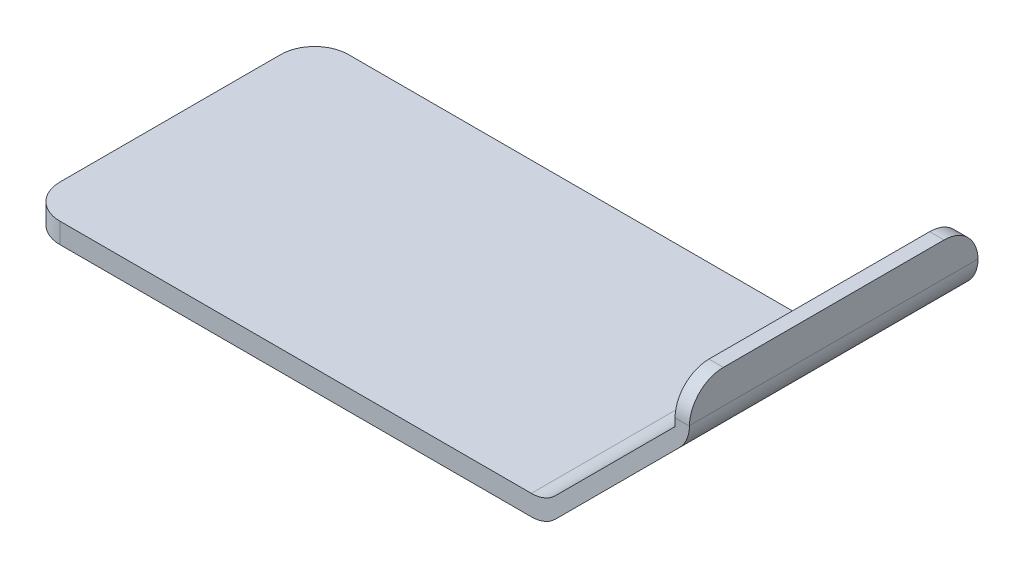
ISO-10303-21;
HEADER;
FILE_DESCRIPTION(('STEP AP214'),'2;1');
FILE_NAME('part.step','',(''),(''),'','','');
FILE_SCHEMA(('AUTOMOTIVE_DESIGN { 1 0 10303 214 1 1 1 1 }'));
ENDSEC;
DATA;
#1=APPLICATION_CONTEXT('core data for automotive mechanical design processes');
#2=APPLICATION_PROTOCOL_DEFINITION('international standard','automotive_design',2000,#1);
#3=PRODUCT_CONTEXT('',#1,'mechanical');
#4=PRODUCT('Part','Part','',(#3));
#5=PRODUCT_RELATED_PRODUCT_CATEGORY('part','',(#4));
#6=PRODUCT_DEFINITION_FORMATION('','',#4);
#7=PRODUCT_DEFINITION_CONTEXT('part definition',#1,'design');
#8=PRODUCT_DEFINITION('design','',#6,#7);
#9=PRODUCT_DEFINITION_SHAPE('','',#8);
#10=(LENGTH_UNIT() NAMED_UNIT(*) SI_UNIT(.MILLI.,.METRE.));
#11=(NAMED_UNIT(*) PLANE_ANGLE_UNIT() SI_UNIT($,.RADIAN.));
#12=(NAMED_UNIT(*) SI_UNIT($,.STERADIAN.) SOLID_ANGLE_UNIT());
#13=UNCERTAINTY_MEASURE_WITH_UNIT(LENGTH_MEASURE(1.E-05),#10,'distance_accuracy_value','');
#14=(GEOMETRIC_REPRESENTATION_CONTEXT(3) GLOBAL_UNCERTAINTY_ASSIGNED_CONTEXT((#13)) GLOBAL_UNIT_ASSIGNED_CONTEXT((#10,
#11,#12)) REPRESENTATION_CONTEXT('',''));
#15=CARTESIAN_POINT('',(0.,0.,0.));
#16=DIRECTION('',(0.,0.,1.));
#17=DIRECTION('',(1.,0.,0.));
#18=AXIS2_PLACEMENT_3D('',#15,#16,#17);
#19=CARTESIAN_POINT('',(0.,3.,0.));
#20=DIRECTION('',(1.,0.,0.));
#21=DIRECTION('',(0.,0.,-1.));
#22=AXIS2_PLACEMENT_3D('',#19,#20,#21);
#23=PLANE('',#22);
#24=DIRECTION('',(0.,0.,1.));
#25=VECTOR('',#24,1.);
#26=CARTESIAN_POINT('',(0.,3.,0.));
#27=LINE('',#26,#25);
#28=CARTESIAN_POINT('',(0.,3.,-37.5));
#29=VERTEX_POINT('',#28);
#30=CARTESIAN_POINT('',(0.,3.,-5.));
#31=VERTEX_POINT('',#30);
#32=EDGE_CURVE('E171',#29,#31,#27,.T.);
#33=ORIENTED_EDGE('',*,*,#32,.F.);
#34=DIRECTION('',(0.,-1.,0.));
#35=VECTOR('',#34,1.);
#36=CARTESIAN_POINT('',(0.,3.,-37.5));
#37=LINE('',#36,#35);
#38=CARTESIAN_POINT('',(0.,0.,-37.5));
#39=VERTEX_POINT('',#38);
#40=EDGE_CURVE('E209',#29,#39,#37,.T.);
#41=ORIENTED_EDGE('',*,*,#40,.T.);
#42=DIRECTION('',(0.,0.,1.));
#43=VECTOR('',#42,1.);
#44=CARTESIAN_POINT('',(0.,0.,0.));
#45=LINE('',#44,#43);
#46=CARTESIAN_POINT('',(0.,0.,-5.));
#47=VERTEX_POINT('',#46);
#48=EDGE_CURVE('E153',#39,#47,#45,.T.);
#49=ORIENTED_EDGE('',*,*,#48,.T.);
#50=DIRECTION('',(0.,-1.,0.));
#51=VECTOR('',#50,1.);
#52=CARTESIAN_POINT('',(0.,3.,-5.));
#53=LINE('',#52,#51);
#54=EDGE_CURVE('E207',#47,#31,#53,.F.);
#55=ORIENTED_EDGE('',*,*,#54,.T.);
#56=EDGE_LOOP('',(#33,#41,#49,#55));
#57=FACE_BOUND('',#56,.T.);
#58=ADVANCED_FACE('F32',(#57),#23,.F.);
#59=CARTESIAN_POINT('',(0.,3.,0.));
#60=DIRECTION('',(0.,0.,-1.));
#61=DIRECTION('',(-1.,0.,0.));
#62=AXIS2_PLACEMENT_3D('',#59,#60,#61);
#63=PLANE('',#62);
#64=CARTESIAN_POINT('',(92.7132034355964,23.2842712474619,0.));
#65=DIRECTION('',(0.,0.,-1.));
#66=DIRECTION('',(-1.,0.,0.));
#67=AXIS2_PLACEMENT_3D('',#64,#65,#66);
#68=CIRCLE('',#67,5.);
#69=CARTESIAN_POINT('',(96.2487373415291,19.7487373415292,0.));
#70=VERTEX_POINT('',#69);
#71=CARTESIAN_POINT('',(97.7126983466966,23.2132034355965,0.));
#72=VERTEX_POINT('',#71);
#73=EDGE_CURVE('E194',#70,#72,#68,.F.);
#74=ORIENTED_EDGE('',*,*,#73,.T.);
#75=DIRECTION('',(-1.,0.,0.));
#76=VECTOR('',#75,1.);
#77=CARTESIAN_POINT('',(95.5918830920367,23.2132034355965,0.));
#78=LINE('',#77,#76);
#79=CARTESIAN_POINT('',(95.5918830920367,23.2132034355965,0.));
#80=VERTEX_POINT('',#79);
#81=EDGE_CURVE('E390',#72,#80,#78,.T.);
#82=ORIENTED_EDGE('',*,*,#81,.T.);
#83=DIRECTION('',(0.,-1.,0.));
#84=VECTOR('',#83,1.);
#85=CARTESIAN_POINT('',(95.5918830920367,22.0918830920368,0.));
#86=LINE('',#85,#84);
#87=CARTESIAN_POINT('',(95.5918830920367,22.0918830920368,0.));
#88=VERTEX_POINT('',#87);
#89=EDGE_CURVE('E157',#80,#88,#86,.T.);
#90=ORIENTED_EDGE('',*,*,#89,.T.);
#91=DIRECTION('',(-0.707106781186546,-0.707106781186549,0.));
#92=VECTOR('',#91,1.);
#93=CARTESIAN_POINT('',(76.5,3.,0.));
#94=LINE('',#93,#92);
#95=CARTESIAN_POINT('',(77.9644660940673,4.46446609406727,0.));
#96=VERTEX_POINT('',#95);
#97=EDGE_CURVE('E152',#88,#96,#94,.T.);
#98=ORIENTED_EDGE('',*,*,#97,.T.);
#99=CARTESIAN_POINT('',(74.4289321881345,8.,0.));
#100=DIRECTION('',(0.,0.,-1.));
#101=DIRECTION('',(-1.,0.,0.));
#102=AXIS2_PLACEMENT_3D('',#99,#100,#101);
#103=CIRCLE('',#102,5.);
#104=CARTESIAN_POINT('',(74.4289321881345,3.,0.));
#105=VERTEX_POINT('',#104);
#106=EDGE_CURVE('E11',#96,#105,#103,.T.);
#107=ORIENTED_EDGE('',*,*,#106,.T.);
#108=DIRECTION('',(1.,0.,0.));
#109=VECTOR('',#108,1.);
#110=CARTESIAN_POINT('',(0.,3.,0.));
#111=LINE('',#110,#109);
#112=CARTESIAN_POINT('',(5.,3.,0.));
#113=VERTEX_POINT('',#112);
#114=EDGE_CURVE('E174',#113,#105,#111,.T.);
#115=ORIENTED_EDGE('',*,*,#114,.F.);
#116=DIRECTION('',(0.,-1.,0.));
#117=VECTOR('',#116,1.);
#118=CARTESIAN_POINT('',(5.,3.,0.));
#119=LINE('',#118,#117);
#120=CARTESIAN_POINT('',(5.,0.,0.));
#121=VERTEX_POINT('',#120);
#122=EDGE_CURVE('E223',#113,#121,#119,.T.);
#123=ORIENTED_EDGE('',*,*,#122,.T.);
#124=DIRECTION('',(1.,0.,0.));
#125=VECTOR('',#124,1.);
#126=CARTESIAN_POINT('',(0.,0.,0.));
#127=LINE('',#126,#125);
#128=CARTESIAN_POINT('',(74.4289321881345,0.,0.));
#129=VERTEX_POINT('',#128);
#130=EDGE_CURVE('E183',#121,#129,#127,.T.);
#131=ORIENTED_EDGE('',*,*,#130,.T.);
#132=CARTESIAN_POINT('',(74.4289321881345,5.,0.));
#133=DIRECTION('',(0.,0.,-1.));
#134=DIRECTION('',(-1.,0.,0.));
#135=AXIS2_PLACEMENT_3D('',#132,#133,#134);
#136=CIRCLE('',#135,5.);
#137=CARTESIAN_POINT('',(77.9644660940673,1.46446609406727,0.));
#138=VERTEX_POINT('',#137);
#139=EDGE_CURVE('E192',#129,#138,#136,.F.);
#140=ORIENTED_EDGE('',*,*,#139,.T.);
#141=DIRECTION('',(0.707106781186546,0.707106781186549,0.));
#142=VECTOR('',#141,1.);
#143=CARTESIAN_POINT('',(76.5,0.,0.));
#144=LINE('',#143,#142);
#145=EDGE_CURVE('E161',#138,#70,#144,.T.);
#146=ORIENTED_EDGE('',*,*,#145,.T.);
#147=EDGE_LOOP('',(#74,#82,#90,#98,#107,#115,#123,#131,#140,#146));
#148=FACE_BOUND('',#147,.T.);
#149=ADVANCED_FACE('F279',(#148),#63,.F.);
#150=CARTESIAN_POINT('',(0.,3.,-42.5));
#151=DIRECTION('',(0.,0.,1.));
#152=DIRECTION('',(1.,0.,0.));
#153=AXIS2_PLACEMENT_3D('',#150,#151,#152);
#154=PLANE('',#153);
#155=DIRECTION('',(0.,-1.,0.));
#156=VECTOR('',#155,1.);
#157=CARTESIAN_POINT('',(95.5918830920367,22.0918830920368,-42.5));
#158=LINE('',#157,#156);
#159=CARTESIAN_POINT('',(95.5918830920367,23.2132034355965,-42.5));
#160=VERTEX_POINT('',#159);
#161=CARTESIAN_POINT('',(95.5918830920367,22.0918830920368,-42.5));
#162=VERTEX_POINT('',#161);
#163=EDGE_CURVE('E139',#160,#162,#158,.T.);
#164=ORIENTED_EDGE('',*,*,#163,.F.);
#165=DIRECTION('',(-1.,0.,0.));
#166=VECTOR('',#165,1.);
#167=CARTESIAN_POINT('',(97.7132034355964,23.2132034355965,-42.5));
#168=LINE('',#167,#166);
#169=CARTESIAN_POINT('',(97.7126983466966,23.2132034355965,-42.5));
#170=VERTEX_POINT('',#169);
#171=EDGE_CURVE('E234',#160,#170,#168,.F.);
#172=ORIENTED_EDGE('',*,*,#171,.T.);
#173=CARTESIAN_POINT('',(92.7132034355964,23.2842712474619,-42.5));
#174=DIRECTION('',(0.,0.,1.));
#175=DIRECTION('',(1.,0.,0.));
#176=AXIS2_PLACEMENT_3D('',#173,#174,#175);
#177=CIRCLE('',#176,5.);
#178=CARTESIAN_POINT('',(96.2487373415291,19.7487373415292,-42.5));
#179=VERTEX_POINT('',#178);
#180=EDGE_CURVE('E202',#170,#179,#177,.F.);
#181=ORIENTED_EDGE('',*,*,#180,.T.);
#182=DIRECTION('',(0.707106781186546,0.707106781186549,0.));
#183=VECTOR('',#182,1.);
#184=CARTESIAN_POINT('',(76.5,0.,-42.5));
#185=LINE('',#184,#183);
#186=CARTESIAN_POINT('',(77.9644660940673,1.46446609406727,-42.5));
#187=VERTEX_POINT('',#186);
#188=EDGE_CURVE('E148',#187,#179,#185,.T.);
#189=ORIENTED_EDGE('',*,*,#188,.F.);
#190=CARTESIAN_POINT('',(74.4289321881345,5.,-42.5));
#191=DIRECTION('',(0.,0.,1.));
#192=DIRECTION('',(1.,0.,0.));
#193=AXIS2_PLACEMENT_3D('',#190,#191,#192);
#194=CIRCLE('',#193,5.);
#195=CARTESIAN_POINT('',(74.4289321881345,0.,-42.5));
#196=VERTEX_POINT('',#195);
#197=EDGE_CURVE('E200',#187,#196,#194,.F.);
#198=ORIENTED_EDGE('',*,*,#197,.T.);
#199=DIRECTION('',(-1.,0.,0.));
#200=VECTOR('',#199,1.);
#201=CARTESIAN_POINT('',(0.,0.,-42.5));
#202=LINE('',#201,#200);
#203=CARTESIAN_POINT('',(5.,0.,-42.5));
#204=VERTEX_POINT('',#203);
#205=EDGE_CURVE('E175',#196,#204,#202,.T.);
#206=ORIENTED_EDGE('',*,*,#205,.T.);
#207=DIRECTION('',(0.,-1.,0.));
#208=VECTOR('',#207,1.);
#209=CARTESIAN_POINT('',(5.,3.,-42.5));
#210=LINE('',#209,#208);
#211=CARTESIAN_POINT('',(5.,3.,-42.5));
#212=VERTEX_POINT('',#211);
#213=EDGE_CURVE('E216',#204,#212,#210,.F.);
#214=ORIENTED_EDGE('',*,*,#213,.T.);
#215=DIRECTION('',(-1.,0.,0.));
#216=VECTOR('',#215,1.);
#217=CARTESIAN_POINT('',(0.,3.,-42.5));
#218=LINE('',#217,#216);
#219=CARTESIAN_POINT('',(74.4289321881345,3.,-42.5));
#220=VERTEX_POINT('',#219);
#221=EDGE_CURVE('E178',#220,#212,#218,.T.);
#222=ORIENTED_EDGE('',*,*,#221,.F.);
#223=CARTESIAN_POINT('',(74.4289321881345,8.,-42.5));
#224=DIRECTION('',(0.,0.,1.));
#225=DIRECTION('',(1.,0.,0.));
#226=AXIS2_PLACEMENT_3D('',#223,#224,#225);
#227=CIRCLE('',#226,5.);
#228=CARTESIAN_POINT('',(77.9644660940673,4.46446609406727,-42.5));
#229=VERTEX_POINT('',#228);
#230=EDGE_CURVE('E40',#220,#229,#227,.T.);
#231=ORIENTED_EDGE('',*,*,#230,.T.);
#232=DIRECTION('',(-0.707106781186546,-0.707106781186549,0.));
#233=VECTOR('',#232,1.);
#234=CARTESIAN_POINT('',(76.5,3.,-42.5));
#235=LINE('',#234,#233);
#236=EDGE_CURVE('E151',#162,#229,#235,.T.);
#237=ORIENTED_EDGE('',*,*,#236,.F.);
#238=EDGE_LOOP('',(#164,#172,#181,#189,#198,#206,#214,#222,#231,#237));
#239=FACE_BOUND('',#238,.T.);
#240=ADVANCED_FACE('F156',(#239),#154,.F.);
#241=CARTESIAN_POINT('',(0.,3.,0.));
#242=DIRECTION('',(0.,-1.,0.));
#243=DIRECTION('',(0.,0.,-1.));
#244=AXIS2_PLACEMENT_3D('',#241,#242,#243);
#245=PLANE('',#244);
#246=ORIENTED_EDGE('',*,*,#114,.T.);
#247=DIRECTION('',(0.,0.,-1.));
#248=VECTOR('',#247,1.);
#249=CARTESIAN_POINT('',(74.4289321881345,3.,0.));
#250=LINE('',#249,#248);
#251=EDGE_CURVE('E371',#105,#220,#250,.T.);
#252=ORIENTED_EDGE('',*,*,#251,.T.);
#253=ORIENTED_EDGE('',*,*,#221,.T.);
#254=CARTESIAN_POINT('',(5.,3.,-37.5));
#255=DIRECTION('',(0.,-1.,0.));
#256=DIRECTION('',(0.,0.,-1.));
#257=AXIS2_PLACEMENT_3D('',#254,#255,#256);
#258=CIRCLE('',#257,5.);
#259=EDGE_CURVE('E221',#212,#29,#258,.F.);
#260=ORIENTED_EDGE('',*,*,#259,.T.);
#261=ORIENTED_EDGE('',*,*,#32,.T.);
#262=CARTESIAN_POINT('',(5.,3.,-5.));
#263=DIRECTION('',(0.,-1.,0.));
#264=DIRECTION('',(0.,0.,-1.));
#265=AXIS2_PLACEMENT_3D('',#262,#263,#264);
#266=CIRCLE('',#265,5.);
#267=EDGE_CURVE('E219',#31,#113,#266,.F.);
#268=ORIENTED_EDGE('',*,*,#267,.T.);
#269=EDGE_LOOP('',(#246,#252,#253,#260,#261,#268));
#270=FACE_BOUND('',#269,.T.);
#271=ADVANCED_FACE('F291',(#270),#245,.F.);
#272=CARTESIAN_POINT('',(0.,0.,0.));
#273=DIRECTION('',(0.,-1.,0.));
#274=DIRECTION('',(0.,0.,-1.));
#275=AXIS2_PLACEMENT_3D('',#272,#273,#274);
#276=PLANE('',#275);
#277=ORIENTED_EDGE('',*,*,#48,.F.);
#278=CARTESIAN_POINT('',(5.,0.,-37.5));
#279=DIRECTION('',(0.,-1.,0.));
#280=DIRECTION('',(0.,0.,-1.));
#281=AXIS2_PLACEMENT_3D('',#278,#279,#280);
#282=CIRCLE('',#281,5.);
#283=EDGE_CURVE('E214',#39,#204,#282,.T.);
#284=ORIENTED_EDGE('',*,*,#283,.T.);
#285=ORIENTED_EDGE('',*,*,#205,.F.);
#286=DIRECTION('',(0.,0.,-1.));
#287=VECTOR('',#286,1.);
#288=CARTESIAN_POINT('',(74.4289321881345,0.,0.));
#289=LINE('',#288,#287);
#290=EDGE_CURVE('E204',#196,#129,#289,.F.);
#291=ORIENTED_EDGE('',*,*,#290,.T.);
#292=ORIENTED_EDGE('',*,*,#130,.F.);
#293=CARTESIAN_POINT('',(5.,0.,-5.));
#294=DIRECTION('',(0.,-1.,0.));
#295=DIRECTION('',(0.,0.,-1.));
#296=AXIS2_PLACEMENT_3D('',#293,#294,#295);
#297=CIRCLE('',#296,5.);
#298=EDGE_CURVE('E212',#121,#47,#297,.T.);
#299=ORIENTED_EDGE('',*,*,#298,.T.);
#300=EDGE_LOOP('',(#277,#284,#285,#291,#292,#299));
#301=FACE_BOUND('',#300,.T.);
#302=ADVANCED_FACE('F292',(#301),#276,.T.);
#303=CARTESIAN_POINT('',(76.5,3.,-42.5));
#304=DIRECTION('',(-0.707106781186549,0.707106781186546,0.));
#305=DIRECTION('',(-0.707106781186546,-0.707106781186549,0.));
#306=AXIS2_PLACEMENT_3D('',#303,#304,#305);
#307=PLANE('',#306);
#308=ORIENTED_EDGE('',*,*,#236,.T.);
#309=DIRECTION('',(0.,0.,-1.));
#310=VECTOR('',#309,1.);
#311=CARTESIAN_POINT('',(77.9644660940673,4.46446609406727,-42.5));
#312=LINE('',#311,#310);
#313=EDGE_CURVE('E53',#229,#96,#312,.F.);
#314=ORIENTED_EDGE('',*,*,#313,.T.);
#315=ORIENTED_EDGE('',*,*,#97,.F.);
#316=DIRECTION('',(0.,0.,1.));
#317=VECTOR('',#316,1.);
#318=CARTESIAN_POINT('',(95.5918830920367,22.0918830920368,-42.5));
#319=LINE('',#318,#317);
#320=EDGE_CURVE('E144',#162,#88,#319,.T.);
#321=ORIENTED_EDGE('',*,*,#320,.F.);
#322=EDGE_LOOP('',(#308,#314,#315,#321));
#323=FACE_BOUND('',#322,.T.);
#324=ADVANCED_FACE('F150',(#323),#307,.T.);
#325=CARTESIAN_POINT('',(95.5918830920367,22.0918830920368,-42.5));
#326=DIRECTION('',(-1.,0.,0.));
#327=DIRECTION('',(0.,0.,1.));
#328=AXIS2_PLACEMENT_3D('',#325,#326,#327);
#329=PLANE('',#328);
#330=DIRECTION('',(0.,0.,1.));
#331=VECTOR('',#330,1.);
#332=CARTESIAN_POINT('',(95.5918830920367,28.2132034355965,-42.5));
#333=LINE('',#332,#331);
#334=CARTESIAN_POINT('',(95.5918830920367,28.2132034355965,-37.5));
#335=VERTEX_POINT('',#334);
#336=CARTESIAN_POINT('',(95.5918830920367,28.2132034355965,-5.));
#337=VERTEX_POINT('',#336);
#338=EDGE_CURVE('E154',#335,#337,#333,.T.);
#339=ORIENTED_EDGE('',*,*,#338,.F.);
#340=CARTESIAN_POINT('',(95.5918830920367,23.2132034355965,-37.5));
#341=DIRECTION('',(-1.,0.,0.));
#342=DIRECTION('',(0.,0.,1.));
#343=AXIS2_PLACEMENT_3D('',#340,#341,#342);
#344=CIRCLE('',#343,5.);
#345=EDGE_CURVE('E145',#335,#160,#344,.T.);
#346=ORIENTED_EDGE('',*,*,#345,.T.);
#347=ORIENTED_EDGE('',*,*,#163,.T.);
#348=ORIENTED_EDGE('',*,*,#320,.T.);
#349=ORIENTED_EDGE('',*,*,#89,.F.);
#350=CARTESIAN_POINT('',(95.5918830920367,23.2132034355965,-5.));
#351=DIRECTION('',(-1.,0.,0.));
#352=DIRECTION('',(0.,0.,1.));
#353=AXIS2_PLACEMENT_3D('',#350,#351,#352);
#354=CIRCLE('',#353,5.);
#355=EDGE_CURVE('E231',#80,#337,#354,.T.);
#356=ORIENTED_EDGE('',*,*,#355,.T.);
#357=EDGE_LOOP('',(#339,#346,#347,#348,#349,#356));
#358=FACE_BOUND('',#357,.T.);
#359=ADVANCED_FACE('F142',(#358),#329,.T.);
#360=CARTESIAN_POINT('',(95.5918830920367,28.2132034355965,-42.5));
#361=DIRECTION('',(0.,1.,0.));
#362=DIRECTION('',(0.,0.,1.));
#363=AXIS2_PLACEMENT_3D('',#360,#361,#362);
#364=PLANE('',#363);
#365=DIRECTION('',(0.,0.,1.));
#366=VECTOR('',#365,1.);
#367=CARTESIAN_POINT('',(97.7132034355964,28.2132034355965,-42.5));
#368=LINE('',#367,#366);
#369=CARTESIAN_POINT('',(97.7132034355964,28.2132034355965,-37.5));
#370=VERTEX_POINT('',#369);
#371=CARTESIAN_POINT('',(97.7132034355964,28.2132034355965,-5.));
#372=VERTEX_POINT('',#371);
#373=EDGE_CURVE('E147',#370,#372,#368,.T.);
#374=ORIENTED_EDGE('',*,*,#373,.F.);
#375=DIRECTION('',(-1.,0.,0.));
#376=VECTOR('',#375,1.);
#377=CARTESIAN_POINT('',(95.5918830920367,28.2132034355965,-37.5));
#378=LINE('',#377,#376);
#379=EDGE_CURVE('E228',#370,#335,#378,.T.);
#380=ORIENTED_EDGE('',*,*,#379,.T.);
#381=ORIENTED_EDGE('',*,*,#338,.T.);
#382=DIRECTION('',(-1.,0.,0.));
#383=VECTOR('',#382,1.);
#384=CARTESIAN_POINT('',(97.7132034355964,28.2132034355965,-5.));
#385=LINE('',#384,#383);
#386=EDGE_CURVE('E226',#337,#372,#385,.F.);
#387=ORIENTED_EDGE('',*,*,#386,.T.);
#388=EDGE_LOOP('',(#374,#380,#381,#387));
#389=FACE_BOUND('',#388,.T.);
#390=ADVANCED_FACE('F306',(#389),#364,.T.);
#391=CARTESIAN_POINT('',(97.7132034355964,21.2132034355965,-42.5));
#392=DIRECTION('',(1.,0.,0.));
#393=DIRECTION('',(0.,1.,0.));
#394=AXIS2_PLACEMENT_3D('',#391,#392,#393);
#395=PLANE('',#394);
#396=DIRECTION('',(0.,0.,1.));
#397=VECTOR('',#396,1.);
#398=CARTESIAN_POINT('',(97.7132034355964,23.2842712474619,-42.5));
#399=LINE('',#398,#397);
#400=CARTESIAN_POINT('',(97.7132034355964,23.2842712474619,-0.000505088899811594));
#401=VERTEX_POINT('',#400);
#402=CARTESIAN_POINT('',(97.7132034355964,23.2842712474619,-42.4994949111002));
#403=VERTEX_POINT('',#402);
#404=EDGE_CURVE('E197',#401,#403,#399,.F.);
#405=ORIENTED_EDGE('',*,*,#404,.T.);
#406=CARTESIAN_POINT('',(97.7132034355964,23.2132034355965,-37.5));
#407=DIRECTION('',(1.,0.,0.));
#408=DIRECTION('',(0.,1.,0.));
#409=AXIS2_PLACEMENT_3D('',#406,#407,#408);
#410=CIRCLE('',#409,5.);
#411=EDGE_CURVE('E393',#403,#370,#410,.T.);
#412=ORIENTED_EDGE('',*,*,#411,.T.);
#413=ORIENTED_EDGE('',*,*,#373,.T.);
#414=CARTESIAN_POINT('',(97.7132034355964,23.2132034355965,-5.));
#415=DIRECTION('',(1.,0.,0.));
#416=DIRECTION('',(0.,1.,0.));
#417=AXIS2_PLACEMENT_3D('',#414,#415,#416);
#418=CIRCLE('',#417,5.);
#419=EDGE_CURVE('E396',#372,#401,#418,.T.);
#420=ORIENTED_EDGE('',*,*,#419,.T.);
#421=EDGE_LOOP('',(#405,#412,#413,#420));
#422=FACE_BOUND('',#421,.T.);
#423=ADVANCED_FACE('F302',(#422),#395,.T.);
#424=CARTESIAN_POINT('',(76.5,0.,-42.5));
#425=DIRECTION('',(0.707106781186549,-0.707106781186546,0.));
#426=DIRECTION('',(0.707106781186546,0.707106781186549,0.));
#427=AXIS2_PLACEMENT_3D('',#424,#425,#426);
#428=PLANE('',#427);
#429=ORIENTED_EDGE('',*,*,#188,.T.);
#430=DIRECTION('',(0.,0.,1.));
#431=VECTOR('',#430,1.);
#432=CARTESIAN_POINT('',(96.2487373415291,19.7487373415292,-42.5));
#433=LINE('',#432,#431);
#434=EDGE_CURVE('E189',#179,#70,#433,.T.);
#435=ORIENTED_EDGE('',*,*,#434,.T.);
#436=ORIENTED_EDGE('',*,*,#145,.F.);
#437=DIRECTION('',(0.,0.,-1.));
#438=VECTOR('',#437,1.);
#439=CARTESIAN_POINT('',(77.9644660940673,1.46446609406727,-42.5));
#440=LINE('',#439,#438);
#441=EDGE_CURVE('E180',#138,#187,#440,.T.);
#442=ORIENTED_EDGE('',*,*,#441,.T.);
#443=EDGE_LOOP('',(#429,#435,#436,#442));
#444=FACE_BOUND('',#443,.T.);
#445=ADVANCED_FACE('F275',(#444),#428,.T.);
#446=CARTESIAN_POINT('',(92.7132034355964,23.2842712474619,-42.5));
#447=DIRECTION('',(0.,0.,1.));
#448=DIRECTION('',(1.,0.,0.));
#449=AXIS2_PLACEMENT_3D('',#446,#447,#448);
#450=CYLINDRICAL_SURFACE('',#449,5.);
#451=ORIENTED_EDGE('',*,*,#180,.F.);
#452=CARTESIAN_POINT('',(97.7126983466966,23.2132034355965,-42.5));
#453=CARTESIAN_POINT('',(97.7128667128522,23.2250480709074,-42.5000000031891));
#454=CARTESIAN_POINT('',(97.7129929866717,23.2368927062183,-42.499957914042));
#455=CARTESIAN_POINT('',(97.7131613496383,23.2605819768401,-42.4997895510754));
#456=CARTESIAN_POINT('',(97.7132034387855,23.272426612151,-42.4996632772559));
#457=CARTESIAN_POINT('',(97.7132034355964,23.2842712474619,-42.4994949111002));
#458=B_SPLINE_CURVE_WITH_KNOTS('',3,(#452,#453,#454,#455,#456,#457),.UNSPECIFIED.,.F.,.F.,(4,2,
4),(0.,0.0355361494819066,0.0710722989638132),.UNSPECIFIED.);
#459=EDGE_CURVE('E242',#170,#403,#458,.T.);
#460=ORIENTED_EDGE('',*,*,#459,.T.);
#461=ORIENTED_EDGE('',*,*,#404,.F.);
#462=CARTESIAN_POINT('',(97.7132034355964,23.2842712474619,-0.000505088899811594));
#463=CARTESIAN_POINT('',(97.7132034387855,23.272426612151,-0.000336722744139081));
#464=CARTESIAN_POINT('',(97.7131613496383,23.2605819768401,-0.000210448924651833));
#465=CARTESIAN_POINT('',(97.7129929866717,23.2368927062183,-4.2085958047869E-05));
#466=CARTESIAN_POINT('',(97.7128667128522,23.2250480709074,3.18906884785484E-09));
#467=CARTESIAN_POINT('',(97.7126983466966,23.2132034355965,0.));
#468=B_SPLINE_CURVE_WITH_KNOTS('',3,(#462,#463,#464,#465,#466,#467),.UNSPECIFIED.,.F.,.F.,(4,2,
4),(0.,0.0355361494819066,0.0710722989638132),.UNSPECIFIED.);
#469=EDGE_CURVE('E236',#401,#72,#468,.T.);
#470=ORIENTED_EDGE('',*,*,#469,.T.);
#471=ORIENTED_EDGE('',*,*,#73,.F.);
#472=ORIENTED_EDGE('',*,*,#434,.F.);
#473=EDGE_LOOP('',(#451,#460,#461,#470,#471,#472));
#474=FACE_BOUND('',#473,.T.);
#475=ADVANCED_FACE('F248',(#474),#450,.T.);
#476=CARTESIAN_POINT('',(74.4289321881345,5.,-42.5));
#477=DIRECTION('',(0.,0.,-1.));
#478=DIRECTION('',(-1.,0.,0.));
#479=AXIS2_PLACEMENT_3D('',#476,#477,#478);
#480=CYLINDRICAL_SURFACE('',#479,5.);
#481=ORIENTED_EDGE('',*,*,#139,.F.);
#482=ORIENTED_EDGE('',*,*,#290,.F.);
#483=ORIENTED_EDGE('',*,*,#197,.F.);
#484=ORIENTED_EDGE('',*,*,#441,.F.);
#485=EDGE_LOOP('',(#481,#482,#483,#484));
#486=FACE_BOUND('',#485,.T.);
#487=ADVANCED_FACE('F267',(#486),#480,.T.);
#488=CARTESIAN_POINT('',(5.,3.,-37.5));
#489=DIRECTION('',(0.,-1.,0.));
#490=DIRECTION('',(0.,0.,-1.));
#491=AXIS2_PLACEMENT_3D('',#488,#489,#490);
#492=CYLINDRICAL_SURFACE('',#491,5.);
#493=ORIENTED_EDGE('',*,*,#259,.F.);
#494=ORIENTED_EDGE('',*,*,#213,.F.);
#495=ORIENTED_EDGE('',*,*,#283,.F.);
#496=ORIENTED_EDGE('',*,*,#40,.F.);
#497=EDGE_LOOP('',(#493,#494,#495,#496));
#498=FACE_BOUND('',#497,.T.);
#499=ADVANCED_FACE('F264',(#498),#492,.T.);
#500=CARTESIAN_POINT('',(5.,3.,-5.));
#501=DIRECTION('',(0.,-1.,0.));
#502=DIRECTION('',(0.,0.,-1.));
#503=AXIS2_PLACEMENT_3D('',#500,#501,#502);
#504=CYLINDRICAL_SURFACE('',#503,5.);
#505=ORIENTED_EDGE('',*,*,#267,.F.);
#506=ORIENTED_EDGE('',*,*,#54,.F.);
#507=ORIENTED_EDGE('',*,*,#298,.F.);
#508=ORIENTED_EDGE('',*,*,#122,.F.);
#509=EDGE_LOOP('',(#505,#506,#507,#508));
#510=FACE_BOUND('',#509,.T.);
#511=ADVANCED_FACE('F260',(#510),#504,.T.);
#512=CARTESIAN_POINT('',(95.5918830920367,23.2132034355965,-37.5));
#513=DIRECTION('',(1.,0.,0.));
#514=DIRECTION('',(0.,0.,-1.));
#515=AXIS2_PLACEMENT_3D('',#512,#513,#514);
#516=CYLINDRICAL_SURFACE('',#515,5.);
#517=ORIENTED_EDGE('',*,*,#459,.F.);
#518=ORIENTED_EDGE('',*,*,#171,.F.);
#519=ORIENTED_EDGE('',*,*,#345,.F.);
#520=ORIENTED_EDGE('',*,*,#379,.F.);
#521=ORIENTED_EDGE('',*,*,#411,.F.);
#522=EDGE_LOOP('',(#517,#518,#519,#520,#521));
#523=FACE_BOUND('',#522,.T.);
#524=ADVANCED_FACE('F255',(#523),#516,.T.);
#525=CARTESIAN_POINT('',(0.,23.2132034355965,-5.));
#526=DIRECTION('',(1.,0.,0.));
#527=DIRECTION('',(0.,0.,-1.));
#528=AXIS2_PLACEMENT_3D('',#525,#526,#527);
#529=CYLINDRICAL_SURFACE('',#528,5.);
#530=ORIENTED_EDGE('',*,*,#419,.F.);
#531=ORIENTED_EDGE('',*,*,#386,.F.);
#532=ORIENTED_EDGE('',*,*,#355,.F.);
#533=ORIENTED_EDGE('',*,*,#81,.F.);
#534=ORIENTED_EDGE('',*,*,#469,.F.);
#535=EDGE_LOOP('',(#530,#531,#532,#533,#534));
#536=FACE_BOUND('',#535,.T.);
#537=ADVANCED_FACE('F252',(#536),#529,.T.);
#538=CARTESIAN_POINT('',(74.4289321881345,8.,0.));
#539=DIRECTION('',(0.,0.,-1.));
#540=DIRECTION('',(-1.,0.,0.));
#541=AXIS2_PLACEMENT_3D('',#538,#539,#540);
#542=CYLINDRICAL_SURFACE('',#541,5.);
#543=ORIENTED_EDGE('',*,*,#106,.F.);
#544=ORIENTED_EDGE('',*,*,#313,.F.);
#545=ORIENTED_EDGE('',*,*,#230,.F.);
#546=ORIENTED_EDGE('',*,*,#251,.F.);
#547=EDGE_LOOP('',(#543,#544,#545,#546));
#548=FACE_BOUND('',#547,.T.);
#549=ADVANCED_FACE('F34',(#548),#542,.F.);
#550=CLOSED_SHELL('',(#58,#149,#240,#271,#302,#324,#359,#390,#423,#445,#475,#487,#499,#511,#524,
#537,#549));
#551=MANIFOLD_SOLID_BREP('B2',#550);
#552=ADVANCED_BREP_SHAPE_REPRESENTATION('',(#18,#551),#14);
#553=SHAPE_DEFINITION_REPRESENTATION(#9,#552);
ENDSEC;
END-ISO-10303-21;
